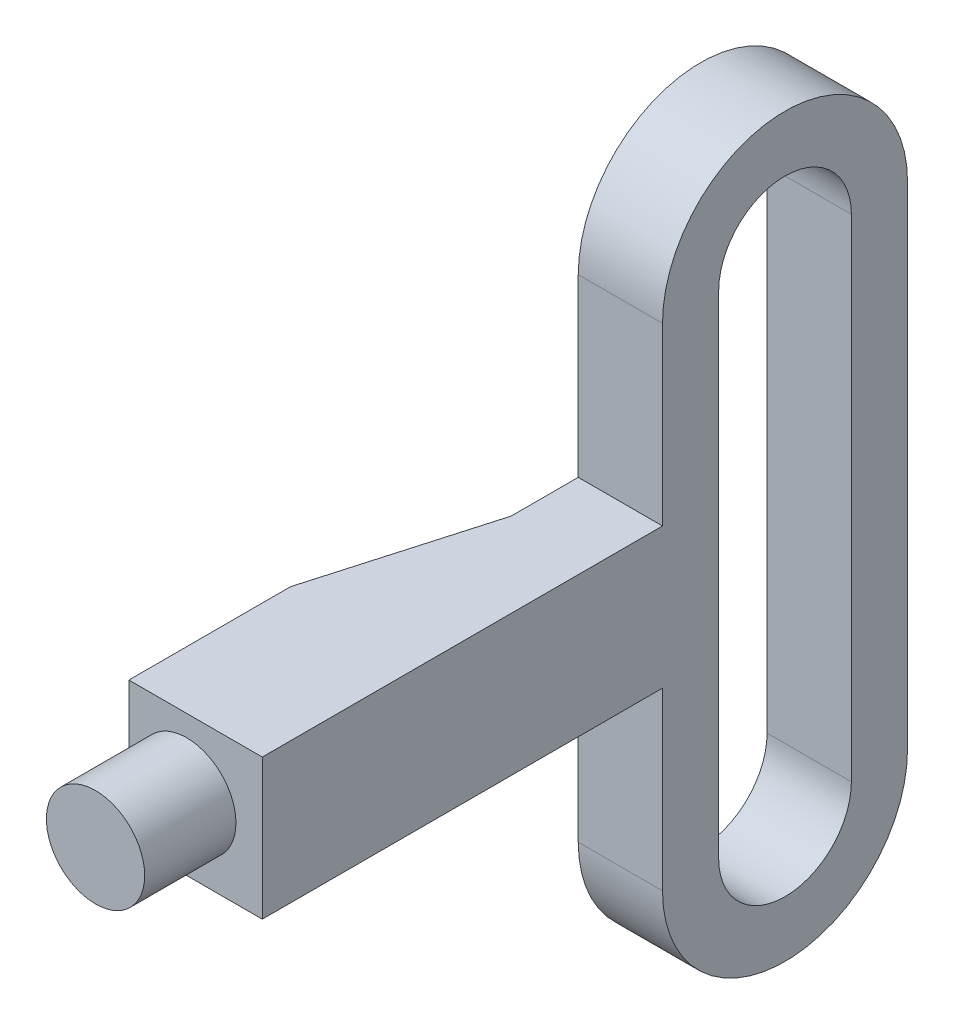
ISO-10303-21;
HEADER;
FILE_DESCRIPTION(('STEP AP214'),'2;1');
FILE_NAME('part.step','',(''),(''),'','','');
FILE_SCHEMA(('AUTOMOTIVE_DESIGN { 1 0 10303 214 1 1 1 1 }'));
ENDSEC;
DATA;
#1=APPLICATION_CONTEXT('core data for automotive mechanical design processes');
#2=APPLICATION_PROTOCOL_DEFINITION('international standard','automotive_design',2000,#1);
#3=PRODUCT_CONTEXT('',#1,'mechanical');
#4=PRODUCT('Part','Part','',(#3));
#5=PRODUCT_RELATED_PRODUCT_CATEGORY('part','',(#4));
#6=PRODUCT_DEFINITION_FORMATION('','',#4);
#7=PRODUCT_DEFINITION_CONTEXT('part definition',#1,'design');
#8=PRODUCT_DEFINITION('design','',#6,#7);
#9=PRODUCT_DEFINITION_SHAPE('','',#8);
#10=(LENGTH_UNIT() NAMED_UNIT(*) SI_UNIT(.MILLI.,.METRE.));
#11=(NAMED_UNIT(*) PLANE_ANGLE_UNIT() SI_UNIT($,.RADIAN.));
#12=(NAMED_UNIT(*) SI_UNIT($,.STERADIAN.) SOLID_ANGLE_UNIT());
#13=UNCERTAINTY_MEASURE_WITH_UNIT(LENGTH_MEASURE(1.E-05),#10,'distance_accuracy_value','');
#14=(GEOMETRIC_REPRESENTATION_CONTEXT(3) GLOBAL_UNCERTAINTY_ASSIGNED_CONTEXT((#13)) GLOBAL_UNIT_ASSIGNED_CONTEXT((#10,
#11,#12)) REPRESENTATION_CONTEXT('',''));
#15=CARTESIAN_POINT('',(0.,0.,0.));
#16=DIRECTION('',(0.,0.,1.));
#17=DIRECTION('',(1.,0.,0.));
#18=AXIS2_PLACEMENT_3D('',#15,#16,#17);
#19=CARTESIAN_POINT('',(24.13,44.45,0.));
#20=DIRECTION('',(-1.,0.,0.));
#21=DIRECTION('',(0.,0.,1.));
#22=AXIS2_PLACEMENT_3D('',#19,#20,#21);
#23=CYLINDRICAL_SURFACE('',#22,12.);
#24=DIRECTION('',(-1.,0.,0.));
#25=VECTOR('',#24,1.);
#26=CARTESIAN_POINT('',(24.13,44.45,12.));
#27=LINE('',#26,#25);
#28=CARTESIAN_POINT('',(24.13,44.45,12.));
#29=VERTEX_POINT('',#28);
#30=CARTESIAN_POINT('',(8.89,44.45,12.));
#31=VERTEX_POINT('',#30);
#32=EDGE_CURVE('E157',#29,#31,#27,.T.);
#33=ORIENTED_EDGE('',*,*,#32,.T.);
#34=CARTESIAN_POINT('',(8.89,44.45,0.));
#35=DIRECTION('',(-1.,0.,0.));
#36=DIRECTION('',(0.,0.,1.));
#37=AXIS2_PLACEMENT_3D('',#34,#35,#36);
#38=CIRCLE('',#37,12.);
#39=CARTESIAN_POINT('',(8.89,44.45,-12.));
#40=VERTEX_POINT('',#39);
#41=EDGE_CURVE('E137',#31,#40,#38,.T.);
#42=ORIENTED_EDGE('',*,*,#41,.T.);
#43=DIRECTION('',(-1.,0.,0.));
#44=VECTOR('',#43,1.);
#45=CARTESIAN_POINT('',(24.13,44.45,-12.));
#46=LINE('',#45,#44);
#47=CARTESIAN_POINT('',(24.13,44.45,-12.));
#48=VERTEX_POINT('',#47);
#49=EDGE_CURVE('E143',#48,#40,#46,.T.);
#50=ORIENTED_EDGE('',*,*,#49,.F.);
#51=CARTESIAN_POINT('',(24.13,44.45,0.));
#52=DIRECTION('',(1.,0.,0.));
#53=DIRECTION('',(0.,0.,-1.));
#54=AXIS2_PLACEMENT_3D('',#51,#52,#53);
#55=CIRCLE('',#54,12.);
#56=EDGE_CURVE('E239',#48,#29,#55,.T.);
#57=ORIENTED_EDGE('',*,*,#56,.T.);
#58=EDGE_LOOP('',(#33,#42,#50,#57));
#59=FACE_BOUND('',#58,.T.);
#60=ADVANCED_FACE('F35',(#59),#23,.F.);
#61=CARTESIAN_POINT('',(24.13,0.,-12.));
#62=DIRECTION('',(0.,0.,1.));
#63=DIRECTION('',(0.,-1.,0.));
#64=AXIS2_PLACEMENT_3D('',#61,#62,#63);
#65=PLANE('',#64);
#66=ORIENTED_EDGE('',*,*,#49,.T.);
#67=DIRECTION('',(0.,-1.,0.));
#68=VECTOR('',#67,1.);
#69=CARTESIAN_POINT('',(8.89,0.,-12.));
#70=LINE('',#69,#68);
#71=CARTESIAN_POINT('',(8.89,-44.45,-12.));
#72=VERTEX_POINT('',#71);
#73=EDGE_CURVE('E152',#40,#72,#70,.T.);
#74=ORIENTED_EDGE('',*,*,#73,.T.);
#75=DIRECTION('',(-1.,0.,0.));
#76=VECTOR('',#75,1.);
#77=CARTESIAN_POINT('',(24.13,-44.45,-12.));
#78=LINE('',#77,#76);
#79=CARTESIAN_POINT('',(24.13,-44.45,-12.));
#80=VERTEX_POINT('',#79);
#81=EDGE_CURVE('E151',#80,#72,#78,.T.);
#82=ORIENTED_EDGE('',*,*,#81,.F.);
#83=DIRECTION('',(0.,1.,0.));
#84=VECTOR('',#83,1.);
#85=CARTESIAN_POINT('',(24.13,0.,-12.));
#86=LINE('',#85,#84);
#87=EDGE_CURVE('E242',#80,#48,#86,.T.);
#88=ORIENTED_EDGE('',*,*,#87,.T.);
#89=EDGE_LOOP('',(#66,#74,#82,#88));
#90=FACE_BOUND('',#89,.T.);
#91=ADVANCED_FACE('F292',(#90),#65,.T.);
#92=CARTESIAN_POINT('',(24.13,-44.45,0.));
#93=DIRECTION('',(-1.,0.,0.));
#94=DIRECTION('',(0.,0.,1.));
#95=AXIS2_PLACEMENT_3D('',#92,#93,#94);
#96=CYLINDRICAL_SURFACE('',#95,12.);
#97=ORIENTED_EDGE('',*,*,#81,.T.);
#98=CARTESIAN_POINT('',(8.89,-44.45,0.));
#99=DIRECTION('',(-1.,0.,0.));
#100=DIRECTION('',(0.,0.,1.));
#101=AXIS2_PLACEMENT_3D('',#98,#99,#100);
#102=CIRCLE('',#101,12.);
#103=CARTESIAN_POINT('',(8.89,-44.45,12.));
#104=VERTEX_POINT('',#103);
#105=EDGE_CURVE('E134',#72,#104,#102,.T.);
#106=ORIENTED_EDGE('',*,*,#105,.T.);
#107=DIRECTION('',(-1.,0.,0.));
#108=VECTOR('',#107,1.);
#109=CARTESIAN_POINT('',(24.13,-44.45,12.));
#110=LINE('',#109,#108);
#111=CARTESIAN_POINT('',(24.13,-44.45,12.));
#112=VERTEX_POINT('',#111);
#113=EDGE_CURVE('E149',#112,#104,#110,.T.);
#114=ORIENTED_EDGE('',*,*,#113,.F.);
#115=CARTESIAN_POINT('',(24.13,-44.45,0.));
#116=DIRECTION('',(1.,0.,0.));
#117=DIRECTION('',(0.,0.,-1.));
#118=AXIS2_PLACEMENT_3D('',#115,#116,#117);
#119=CIRCLE('',#118,12.);
#120=EDGE_CURVE('E245',#112,#80,#119,.T.);
#121=ORIENTED_EDGE('',*,*,#120,.T.);
#122=EDGE_LOOP('',(#97,#106,#114,#121));
#123=FACE_BOUND('',#122,.T.);
#124=ADVANCED_FACE('F147',(#123),#96,.F.);
#125=CARTESIAN_POINT('',(24.13,0.,22.16));
#126=DIRECTION('',(0.,0.,1.));
#127=DIRECTION('',(0.,-1.,0.));
#128=AXIS2_PLACEMENT_3D('',#125,#126,#127);
#129=PLANE('',#128);
#130=DIRECTION('',(-1.,0.,0.));
#131=VECTOR('',#130,1.);
#132=CARTESIAN_POINT('',(24.13,-12.7,22.16));
#133=LINE('',#132,#131);
#134=CARTESIAN_POINT('',(24.13,-12.7,22.16));
#135=VERTEX_POINT('',#134);
#136=CARTESIAN_POINT('',(8.89,-12.7,22.16));
#137=VERTEX_POINT('',#136);
#138=EDGE_CURVE('E160',#135,#137,#133,.T.);
#139=ORIENTED_EDGE('',*,*,#138,.T.);
#140=DIRECTION('',(0.,-1.,0.));
#141=VECTOR('',#140,1.);
#142=CARTESIAN_POINT('',(8.89,0.,22.16));
#143=LINE('',#142,#141);
#144=CARTESIAN_POINT('',(8.89,-44.45,22.16));
#145=VERTEX_POINT('',#144);
#146=EDGE_CURVE('E202',#137,#145,#143,.T.);
#147=ORIENTED_EDGE('',*,*,#146,.T.);
#148=DIRECTION('',(-1.,0.,0.));
#149=VECTOR('',#148,1.);
#150=CARTESIAN_POINT('',(24.13,-44.45,22.16));
#151=LINE('',#150,#149);
#152=CARTESIAN_POINT('',(24.13,-44.45,22.16));
#153=VERTEX_POINT('',#152);
#154=EDGE_CURVE('E178',#153,#145,#151,.T.);
#155=ORIENTED_EDGE('',*,*,#154,.F.);
#156=DIRECTION('',(0.,1.,0.));
#157=VECTOR('',#156,1.);
#158=CARTESIAN_POINT('',(24.13,0.,22.16));
#159=LINE('',#158,#157);
#160=EDGE_CURVE('E226',#153,#135,#159,.T.);
#161=ORIENTED_EDGE('',*,*,#160,.T.);
#162=EDGE_LOOP('',(#139,#147,#155,#161));
#163=FACE_BOUND('',#162,.T.);
#164=ADVANCED_FACE('F261',(#163),#129,.T.);
#165=CARTESIAN_POINT('',(24.13,-44.45,0.));
#166=DIRECTION('',(-1.,0.,0.));
#167=DIRECTION('',(0.,0.,1.));
#168=AXIS2_PLACEMENT_3D('',#165,#166,#167);
#169=CYLINDRICAL_SURFACE('',#168,22.16);
#170=CARTESIAN_POINT('',(8.89,-44.45,0.));
#171=DIRECTION('',(-1.,0.,0.));
#172=DIRECTION('',(0.,0.,1.));
#173=AXIS2_PLACEMENT_3D('',#170,#171,#172);
#174=CIRCLE('',#173,22.16);
#175=CARTESIAN_POINT('',(8.89,-44.45,-22.16));
#176=VERTEX_POINT('',#175);
#177=EDGE_CURVE('E269',#176,#145,#174,.T.);
#178=ORIENTED_EDGE('',*,*,#177,.F.);
#179=DIRECTION('',(-1.,0.,0.));
#180=VECTOR('',#179,1.);
#181=CARTESIAN_POINT('',(24.13,-44.45,-22.16));
#182=LINE('',#181,#180);
#183=CARTESIAN_POINT('',(24.13,-44.45,-22.16));
#184=VERTEX_POINT('',#183);
#185=EDGE_CURVE('E175',#184,#176,#182,.T.);
#186=ORIENTED_EDGE('',*,*,#185,.F.);
#187=CARTESIAN_POINT('',(24.13,-44.45,0.));
#188=DIRECTION('',(1.,0.,0.));
#189=DIRECTION('',(0.,0.,-1.));
#190=AXIS2_PLACEMENT_3D('',#187,#188,#189);
#191=CIRCLE('',#190,22.16);
#192=EDGE_CURVE('E229',#153,#184,#191,.T.);
#193=ORIENTED_EDGE('',*,*,#192,.F.);
#194=ORIENTED_EDGE('',*,*,#154,.T.);
#195=EDGE_LOOP('',(#178,#186,#193,#194));
#196=FACE_BOUND('',#195,.T.);
#197=ADVANCED_FACE('F268',(#196),#169,.T.);
#198=CARTESIAN_POINT('',(24.13,0.,-22.16));
#199=DIRECTION('',(0.,0.,1.));
#200=DIRECTION('',(0.,-1.,0.));
#201=AXIS2_PLACEMENT_3D('',#198,#199,#200);
#202=PLANE('',#201);
#203=DIRECTION('',(0.,-1.,0.));
#204=VECTOR('',#203,1.);
#205=CARTESIAN_POINT('',(8.89,0.,-22.16));
#206=LINE('',#205,#204);
#207=CARTESIAN_POINT('',(8.89,44.45,-22.16));
#208=VERTEX_POINT('',#207);
#209=EDGE_CURVE('E274',#208,#176,#206,.T.);
#210=ORIENTED_EDGE('',*,*,#209,.F.);
#211=DIRECTION('',(-1.,0.,0.));
#212=VECTOR('',#211,1.);
#213=CARTESIAN_POINT('',(24.13,44.45,-22.16));
#214=LINE('',#213,#212);
#215=CARTESIAN_POINT('',(24.13,44.45,-22.16));
#216=VERTEX_POINT('',#215);
#217=EDGE_CURVE('E172',#216,#208,#214,.T.);
#218=ORIENTED_EDGE('',*,*,#217,.F.);
#219=DIRECTION('',(0.,1.,0.));
#220=VECTOR('',#219,1.);
#221=CARTESIAN_POINT('',(24.13,0.,-22.16));
#222=LINE('',#221,#220);
#223=EDGE_CURVE('E232',#184,#216,#222,.T.);
#224=ORIENTED_EDGE('',*,*,#223,.F.);
#225=ORIENTED_EDGE('',*,*,#185,.T.);
#226=EDGE_LOOP('',(#210,#218,#224,#225));
#227=FACE_BOUND('',#226,.T.);
#228=ADVANCED_FACE('F272',(#227),#202,.F.);
#229=CARTESIAN_POINT('',(24.13,44.45,0.));
#230=DIRECTION('',(-1.,0.,0.));
#231=DIRECTION('',(0.,0.,1.));
#232=AXIS2_PLACEMENT_3D('',#229,#230,#231);
#233=CYLINDRICAL_SURFACE('',#232,22.16);
#234=CARTESIAN_POINT('',(8.89,44.45,0.));
#235=DIRECTION('',(-1.,0.,0.));
#236=DIRECTION('',(0.,0.,1.));
#237=AXIS2_PLACEMENT_3D('',#234,#235,#236);
#238=CIRCLE('',#237,22.16);
#239=CARTESIAN_POINT('',(8.89,44.45,22.16));
#240=VERTEX_POINT('',#239);
#241=EDGE_CURVE('E284',#240,#208,#238,.T.);
#242=ORIENTED_EDGE('',*,*,#241,.F.);
#243=DIRECTION('',(-1.,0.,0.));
#244=VECTOR('',#243,1.);
#245=CARTESIAN_POINT('',(24.13,44.45,22.16));
#246=LINE('',#245,#244);
#247=CARTESIAN_POINT('',(24.13,44.45,22.16));
#248=VERTEX_POINT('',#247);
#249=EDGE_CURVE('E169',#248,#240,#246,.T.);
#250=ORIENTED_EDGE('',*,*,#249,.F.);
#251=CARTESIAN_POINT('',(24.13,44.45,0.));
#252=DIRECTION('',(1.,0.,0.));
#253=DIRECTION('',(0.,0.,-1.));
#254=AXIS2_PLACEMENT_3D('',#251,#252,#253);
#255=CIRCLE('',#254,22.16);
#256=EDGE_CURVE('E234',#216,#248,#255,.T.);
#257=ORIENTED_EDGE('',*,*,#256,.F.);
#258=ORIENTED_EDGE('',*,*,#217,.T.);
#259=EDGE_LOOP('',(#242,#250,#257,#258));
#260=FACE_BOUND('',#259,.T.);
#261=ADVANCED_FACE('F278',(#260),#233,.T.);
#262=ORIENTED_EDGE('',*,*,#249,.T.);
#263=DIRECTION('',(0.,-1.,0.));
#264=VECTOR('',#263,1.);
#265=CARTESIAN_POINT('',(8.89,0.,22.16));
#266=LINE('',#265,#264);
#267=CARTESIAN_POINT('',(8.89,12.7,22.16));
#268=VERTEX_POINT('',#267);
#269=EDGE_CURVE('E283',#240,#268,#266,.T.);
#270=ORIENTED_EDGE('',*,*,#269,.T.);
#271=DIRECTION('',(-1.,0.,0.));
#272=VECTOR('',#271,1.);
#273=CARTESIAN_POINT('',(24.13,12.7,22.16));
#274=LINE('',#273,#272);
#275=CARTESIAN_POINT('',(24.13,12.7,22.16));
#276=VERTEX_POINT('',#275);
#277=EDGE_CURVE('E166',#276,#268,#274,.T.);
#278=ORIENTED_EDGE('',*,*,#277,.F.);
#279=EDGE_CURVE('E230',#276,#248,#159,.T.);
#280=ORIENTED_EDGE('',*,*,#279,.T.);
#281=EDGE_LOOP('',(#262,#270,#278,#280));
#282=FACE_BOUND('',#281,.T.);
#283=ADVANCED_FACE('F281',(#282),#129,.T.);
#284=CARTESIAN_POINT('',(24.13,0.,12.));
#285=DIRECTION('',(0.,0.,1.));
#286=DIRECTION('',(0.,-1.,0.));
#287=AXIS2_PLACEMENT_3D('',#284,#285,#286);
#288=PLANE('',#287);
#289=DIRECTION('',(0.,-1.,0.));
#290=VECTOR('',#289,1.);
#291=CARTESIAN_POINT('',(8.89,0.,12.));
#292=LINE('',#291,#290);
#293=EDGE_CURVE('E130',#31,#104,#292,.T.);
#294=ORIENTED_EDGE('',*,*,#293,.F.);
#295=ORIENTED_EDGE('',*,*,#32,.F.);
#296=DIRECTION('',(0.,1.,0.));
#297=VECTOR('',#296,1.);
#298=CARTESIAN_POINT('',(24.13,0.,12.));
#299=LINE('',#298,#297);
#300=EDGE_CURVE('E155',#112,#29,#299,.T.);
#301=ORIENTED_EDGE('',*,*,#300,.F.);
#302=ORIENTED_EDGE('',*,*,#113,.T.);
#303=EDGE_LOOP('',(#294,#295,#301,#302));
#304=FACE_BOUND('',#303,.T.);
#305=ADVANCED_FACE('F154',(#304),#288,.F.);
#306=CARTESIAN_POINT('',(24.13,-12.7,0.));
#307=DIRECTION('',(0.,-1.,0.));
#308=DIRECTION('',(0.,0.,-1.));
#309=AXIS2_PLACEMENT_3D('',#306,#307,#308);
#310=PLANE('',#309);
#311=DIRECTION('',(0.,0.,1.));
#312=VECTOR('',#311,1.);
#313=CARTESIAN_POINT('',(0.,-12.7,0.));
#314=LINE('',#313,#312);
#315=CARTESIAN_POINT('',(0.,-12.7,65.3142318222825));
#316=VERTEX_POINT('',#315);
#317=CARTESIAN_POINT('',(0.,-12.7,94.55));
#318=VERTEX_POINT('',#317);
#319=EDGE_CURVE('E49',#316,#318,#314,.T.);
#320=ORIENTED_EDGE('',*,*,#319,.F.);
#321=DIRECTION('',(0.275637355816997,0.,-0.96126169593832));
#322=VECTOR('',#321,1.);
#323=CARTESIAN_POINT('',(8.89,-12.7,34.3111174165365));
#324=LINE('',#323,#322);
#325=CARTESIAN_POINT('',(8.89,-12.7,34.3111174165365));
#326=VERTEX_POINT('',#325);
#327=EDGE_CURVE('E11',#316,#326,#324,.T.);
#328=ORIENTED_EDGE('',*,*,#327,.T.);
#329=DIRECTION('',(0.,0.,-1.));
#330=VECTOR('',#329,1.);
#331=CARTESIAN_POINT('',(8.89,-12.7,0.));
#332=LINE('',#331,#330);
#333=EDGE_CURVE('E198',#326,#137,#332,.T.);
#334=ORIENTED_EDGE('',*,*,#333,.T.);
#335=ORIENTED_EDGE('',*,*,#138,.F.);
#336=DIRECTION('',(0.,0.,1.));
#337=VECTOR('',#336,1.);
#338=CARTESIAN_POINT('',(24.13,-12.7,0.));
#339=LINE('',#338,#337);
#340=CARTESIAN_POINT('',(24.13,-12.7,94.55));
#341=VERTEX_POINT('',#340);
#342=EDGE_CURVE('E223',#135,#341,#339,.T.);
#343=ORIENTED_EDGE('',*,*,#342,.T.);
#344=DIRECTION('',(1.,0.,0.));
#345=VECTOR('',#344,1.);
#346=CARTESIAN_POINT('',(0.,-12.7,94.55));
#347=LINE('',#346,#345);
#348=EDGE_CURVE('E219',#318,#341,#347,.T.);
#349=ORIENTED_EDGE('',*,*,#348,.F.);
#350=EDGE_LOOP('',(#320,#328,#334,#335,#343,#349));
#351=FACE_BOUND('',#350,.T.);
#352=ADVANCED_FACE('F197',(#351),#310,.T.);
#353=CARTESIAN_POINT('',(24.13,12.7,0.));
#354=DIRECTION('',(0.,-1.,0.));
#355=DIRECTION('',(0.,0.,-1.));
#356=AXIS2_PLACEMENT_3D('',#353,#354,#355);
#357=PLANE('',#356);
#358=DIRECTION('',(0.,0.,-1.));
#359=VECTOR('',#358,1.);
#360=CARTESIAN_POINT('',(8.89,12.7,0.));
#361=LINE('',#360,#359);
#362=CARTESIAN_POINT('',(8.89,12.7,34.3111174165365));
#363=VERTEX_POINT('',#362);
#364=EDGE_CURVE('E204',#363,#268,#361,.T.);
#365=ORIENTED_EDGE('',*,*,#364,.F.);
#366=DIRECTION('',(-0.275637355816997,0.,0.96126169593832));
#367=VECTOR('',#366,1.);
#368=CARTESIAN_POINT('',(19.138934555483,12.7,-1.43116498623547));
#369=LINE('',#368,#367);
#370=CARTESIAN_POINT('',(0.,12.7,65.3142318222825));
#371=VERTEX_POINT('',#370);
#372=EDGE_CURVE('E185',#363,#371,#369,.T.);
#373=ORIENTED_EDGE('',*,*,#372,.T.);
#374=DIRECTION('',(0.,0.,1.));
#375=VECTOR('',#374,1.);
#376=CARTESIAN_POINT('',(0.,12.7,0.));
#377=LINE('',#376,#375);
#378=CARTESIAN_POINT('',(0.,12.7,94.55));
#379=VERTEX_POINT('',#378);
#380=EDGE_CURVE('E193',#371,#379,#377,.T.);
#381=ORIENTED_EDGE('',*,*,#380,.T.);
#382=DIRECTION('',(-1.,0.,0.));
#383=VECTOR('',#382,1.);
#384=CARTESIAN_POINT('',(24.13,12.7,94.55));
#385=LINE('',#384,#383);
#386=CARTESIAN_POINT('',(24.13,12.7,94.55));
#387=VERTEX_POINT('',#386);
#388=EDGE_CURVE('E213',#387,#379,#385,.T.);
#389=ORIENTED_EDGE('',*,*,#388,.F.);
#390=DIRECTION('',(0.,0.,1.));
#391=VECTOR('',#390,1.);
#392=CARTESIAN_POINT('',(24.13,12.7,0.));
#393=LINE('',#392,#391);
#394=EDGE_CURVE('E236',#276,#387,#393,.T.);
#395=ORIENTED_EDGE('',*,*,#394,.F.);
#396=ORIENTED_EDGE('',*,*,#277,.T.);
#397=EDGE_LOOP('',(#365,#373,#381,#389,#395,#396));
#398=FACE_BOUND('',#397,.T.);
#399=ADVANCED_FACE('F250',(#398),#357,.F.);
#400=CARTESIAN_POINT('',(24.13,0.,0.));
#401=DIRECTION('',(1.,0.,0.));
#402=DIRECTION('',(0.,0.,-1.));
#403=AXIS2_PLACEMENT_3D('',#400,#401,#402);
#404=PLANE('',#403);
#405=ORIENTED_EDGE('',*,*,#56,.F.);
#406=ORIENTED_EDGE('',*,*,#87,.F.);
#407=ORIENTED_EDGE('',*,*,#120,.F.);
#408=ORIENTED_EDGE('',*,*,#300,.T.);
#409=EDGE_LOOP('',(#405,#406,#407,#408));
#410=FACE_BOUND('',#409,.T.);
#411=ORIENTED_EDGE('',*,*,#394,.T.);
#412=DIRECTION('',(0.,1.,0.));
#413=VECTOR('',#412,1.);
#414=CARTESIAN_POINT('',(24.13,-12.7,94.55));
#415=LINE('',#414,#413);
#416=EDGE_CURVE('E221',#341,#387,#415,.T.);
#417=ORIENTED_EDGE('',*,*,#416,.F.);
#418=ORIENTED_EDGE('',*,*,#342,.F.);
#419=ORIENTED_EDGE('',*,*,#160,.F.);
#420=ORIENTED_EDGE('',*,*,#192,.T.);
#421=ORIENTED_EDGE('',*,*,#223,.T.);
#422=ORIENTED_EDGE('',*,*,#256,.T.);
#423=ORIENTED_EDGE('',*,*,#279,.F.);
#424=EDGE_LOOP('',(#411,#417,#418,#419,#420,#421,#422,#423));
#425=FACE_BOUND('',#424,.T.);
#426=ADVANCED_FACE('F257',(#410,#425),#404,.T.);
#427=CARTESIAN_POINT('',(0.,0.,0.));
#428=DIRECTION('',(1.,0.,0.));
#429=DIRECTION('',(0.,0.,-1.));
#430=AXIS2_PLACEMENT_3D('',#427,#428,#429);
#431=PLANE('',#430);
#432=ORIENTED_EDGE('',*,*,#380,.F.);
#433=DIRECTION('',(0.,-1.,0.));
#434=VECTOR('',#433,1.);
#435=CARTESIAN_POINT('',(0.,0.,65.3142318222825));
#436=LINE('',#435,#434);
#437=EDGE_CURVE('E44',#371,#316,#436,.T.);
#438=ORIENTED_EDGE('',*,*,#437,.T.);
#439=ORIENTED_EDGE('',*,*,#319,.T.);
#440=DIRECTION('',(0.,-1.,0.));
#441=VECTOR('',#440,1.);
#442=CARTESIAN_POINT('',(0.,12.7,94.55));
#443=LINE('',#442,#441);
#444=EDGE_CURVE('E217',#379,#318,#443,.T.);
#445=ORIENTED_EDGE('',*,*,#444,.F.);
#446=EDGE_LOOP('',(#432,#438,#439,#445));
#447=FACE_BOUND('',#446,.T.);
#448=ADVANCED_FACE('F190',(#447),#431,.F.);
#449=CARTESIAN_POINT('',(0.,0.,94.55));
#450=DIRECTION('',(0.,0.,1.));
#451=DIRECTION('',(1.,0.,0.));
#452=AXIS2_PLACEMENT_3D('',#449,#450,#451);
#453=PLANE('',#452);
#454=CARTESIAN_POINT('',(10.4775,0.,94.55));
#455=DIRECTION('',(0.,0.,1.));
#456=DIRECTION('',(1.,0.,0.));
#457=AXIS2_PLACEMENT_3D('',#454,#455,#456);
#458=CIRCLE('',#457,8.89);
#459=CARTESIAN_POINT('',(19.3675,0.,94.55));
#460=VERTEX_POINT('',#459);
#461=EDGE_CURVE('E207',#460,#460,#458,.T.);
#462=ORIENTED_EDGE('',*,*,#461,.F.);
#463=EDGE_LOOP('',(#462));
#464=FACE_BOUND('',#463,.T.);
#465=ORIENTED_EDGE('',*,*,#388,.T.);
#466=ORIENTED_EDGE('',*,*,#444,.T.);
#467=ORIENTED_EDGE('',*,*,#348,.T.);
#468=ORIENTED_EDGE('',*,*,#416,.T.);
#469=EDGE_LOOP('',(#465,#466,#467,#468));
#470=FACE_BOUND('',#469,.T.);
#471=ADVANCED_FACE('F253',(#464,#470),#453,.T.);
#472=CARTESIAN_POINT('',(10.4775,0.,94.55));
#473=DIRECTION('',(0.,0.,1.));
#474=DIRECTION('',(1.,0.,0.));
#475=AXIS2_PLACEMENT_3D('',#472,#473,#474);
#476=CYLINDRICAL_SURFACE('',#475,8.89);
#477=ORIENTED_EDGE('',*,*,#461,.T.);
#478=EDGE_LOOP('',(#477));
#479=FACE_BOUND('',#478,.T.);
#480=CARTESIAN_POINT('',(10.4775,0.,111.06));
#481=DIRECTION('',(0.,0.,1.));
#482=DIRECTION('',(1.,0.,0.));
#483=AXIS2_PLACEMENT_3D('',#480,#481,#482);
#484=CIRCLE('',#483,8.89);
#485=CARTESIAN_POINT('',(19.3675,0.,111.06));
#486=VERTEX_POINT('',#485);
#487=EDGE_CURVE('E203',#486,#486,#484,.T.);
#488=ORIENTED_EDGE('',*,*,#487,.F.);
#489=EDGE_LOOP('',(#488));
#490=FACE_BOUND('',#489,.T.);
#491=ADVANCED_FACE('F328',(#479,#490),#476,.T.);
#492=CARTESIAN_POINT('',(24.13,0.,111.06));
#493=DIRECTION('',(0.,0.,1.));
#494=DIRECTION('',(1.,0.,0.));
#495=AXIS2_PLACEMENT_3D('',#492,#493,#494);
#496=PLANE('',#495);
#497=ORIENTED_EDGE('',*,*,#487,.T.);
#498=EDGE_LOOP('',(#497));
#499=FACE_BOUND('',#498,.T.);
#500=ADVANCED_FACE('F326',(#499),#496,.T.);
#501=CARTESIAN_POINT('',(8.89,0.,0.));
#502=DIRECTION('',(-1.,0.,0.));
#503=DIRECTION('',(0.,0.,1.));
#504=AXIS2_PLACEMENT_3D('',#501,#502,#503);
#505=PLANE('',#504);
#506=ORIENTED_EDGE('',*,*,#293,.T.);
#507=ORIENTED_EDGE('',*,*,#105,.F.);
#508=ORIENTED_EDGE('',*,*,#73,.F.);
#509=ORIENTED_EDGE('',*,*,#41,.F.);
#510=EDGE_LOOP('',(#506,#507,#508,#509));
#511=FACE_BOUND('',#510,.T.);
#512=ORIENTED_EDGE('',*,*,#333,.F.);
#513=DIRECTION('',(0.,1.,0.));
#514=VECTOR('',#513,1.);
#515=CARTESIAN_POINT('',(8.89,0.,34.3111174165365));
#516=LINE('',#515,#514);
#517=EDGE_CURVE('E142',#326,#363,#516,.T.);
#518=ORIENTED_EDGE('',*,*,#517,.T.);
#519=ORIENTED_EDGE('',*,*,#364,.T.);
#520=ORIENTED_EDGE('',*,*,#269,.F.);
#521=ORIENTED_EDGE('',*,*,#241,.T.);
#522=ORIENTED_EDGE('',*,*,#209,.T.);
#523=ORIENTED_EDGE('',*,*,#177,.T.);
#524=ORIENTED_EDGE('',*,*,#146,.F.);
#525=EDGE_LOOP('',(#512,#518,#519,#520,#521,#522,#523,#524));
#526=FACE_BOUND('',#525,.T.);
#527=ADVANCED_FACE('F132',(#511,#526),#505,.T.);
#528=CARTESIAN_POINT('',(8.89,0.,34.3111174165365));
#529=DIRECTION('',(0.96126169593832,0.,0.275637355816997));
#530=DIRECTION('',(0.,1.,0.));
#531=AXIS2_PLACEMENT_3D('',#528,#529,#530);
#532=PLANE('',#531);
#533=ORIENTED_EDGE('',*,*,#327,.F.);
#534=ORIENTED_EDGE('',*,*,#437,.F.);
#535=ORIENTED_EDGE('',*,*,#372,.F.);
#536=ORIENTED_EDGE('',*,*,#517,.F.);
#537=EDGE_LOOP('',(#533,#534,#535,#536));
#538=FACE_BOUND('',#537,.T.);
#539=ADVANCED_FACE('F37',(#538),#532,.F.);
#540=CLOSED_SHELL('',(#60,#91,#124,#164,#197,#228,#261,#283,#305,#352,#399,#426,#448,#471,#491,
#500,#527,#539));
#541=MANIFOLD_SOLID_BREP('B2',#540);
#542=ADVANCED_BREP_SHAPE_REPRESENTATION('',(#18,#541),#14);
#543=SHAPE_DEFINITION_REPRESENTATION(#9,#542);
ENDSEC;
END-ISO-10303-21;
